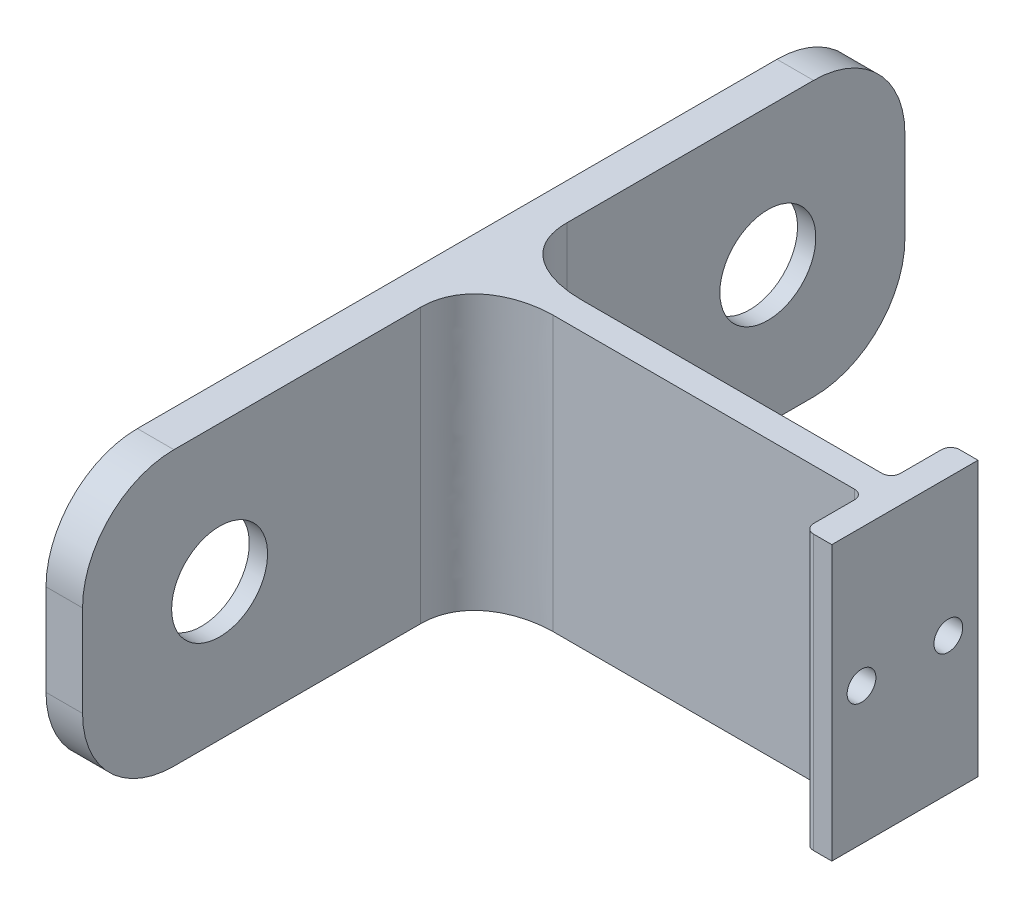
ISO-10303-21;
HEADER;
FILE_DESCRIPTION(('STEP AP214'),'2;1');
FILE_NAME('part.step','',(''),(''),'','','');
FILE_SCHEMA(('AUTOMOTIVE_DESIGN { 1 0 10303 214 1 1 1 1 }'));
ENDSEC;
DATA;
#1=APPLICATION_CONTEXT('core data for automotive mechanical design processes');
#2=APPLICATION_PROTOCOL_DEFINITION('international standard','automotive_design',2000,#1);
#3=PRODUCT_CONTEXT('',#1,'mechanical');
#4=PRODUCT('Part','Part','',(#3));
#5=PRODUCT_RELATED_PRODUCT_CATEGORY('part','',(#4));
#6=PRODUCT_DEFINITION_FORMATION('','',#4);
#7=PRODUCT_DEFINITION_CONTEXT('part definition',#1,'design');
#8=PRODUCT_DEFINITION('design','',#6,#7);
#9=PRODUCT_DEFINITION_SHAPE('','',#8);
#10=(LENGTH_UNIT() NAMED_UNIT(*) SI_UNIT(.MILLI.,.METRE.));
#11=(NAMED_UNIT(*) PLANE_ANGLE_UNIT() SI_UNIT($,.RADIAN.));
#12=(NAMED_UNIT(*) SI_UNIT($,.STERADIAN.) SOLID_ANGLE_UNIT());
#13=UNCERTAINTY_MEASURE_WITH_UNIT(LENGTH_MEASURE(1.E-05),#10,'distance_accuracy_value','');
#14=(GEOMETRIC_REPRESENTATION_CONTEXT(3) GLOBAL_UNCERTAINTY_ASSIGNED_CONTEXT((#13)) GLOBAL_UNIT_ASSIGNED_CONTEXT((#10,
#11,#12)) REPRESENTATION_CONTEXT('',''));
#15=CARTESIAN_POINT('',(0.,0.,0.));
#16=DIRECTION('',(0.,0.,1.));
#17=DIRECTION('',(1.,0.,0.));
#18=AXIS2_PLACEMENT_3D('',#15,#16,#17);
#19=CARTESIAN_POINT('',(4.,15.,45.));
#20=DIRECTION('',(0.,-1.,0.));
#21=DIRECTION('',(0.,0.,-1.));
#22=AXIS2_PLACEMENT_3D('',#19,#20,#21);
#23=PLANE('',#22);
#24=DIRECTION('',(0.,0.,1.));
#25=VECTOR('',#24,1.);
#26=CARTESIAN_POINT('',(46.,15.,-8.));
#27=LINE('',#26,#25);
#28=CARTESIAN_POINT('',(46.,15.,2.5));
#29=VERTEX_POINT('',#28);
#30=CARTESIAN_POINT('',(46.,15.,7.));
#31=VERTEX_POINT('',#30);
#32=EDGE_CURVE('E450',#29,#31,#27,.T.);
#33=ORIENTED_EDGE('',*,*,#32,.T.);
#34=CARTESIAN_POINT('',(47.,15.,7.));
#35=DIRECTION('',(0.,-1.,0.));
#36=DIRECTION('',(0.,0.,-1.));
#37=AXIS2_PLACEMENT_3D('',#34,#35,#36);
#38=CIRCLE('',#37,1.);
#39=CARTESIAN_POINT('',(47.,15.,8.));
#40=VERTEX_POINT('',#39);
#41=EDGE_CURVE('E352',#31,#40,#38,.F.);
#42=ORIENTED_EDGE('',*,*,#41,.T.);
#43=DIRECTION('',(-1.,0.,0.));
#44=VECTOR('',#43,1.);
#45=CARTESIAN_POINT('',(49.,15.,8.));
#46=LINE('',#45,#44);
#47=CARTESIAN_POINT('',(49.,15.,8.));
#48=VERTEX_POINT('',#47);
#49=EDGE_CURVE('E443',#48,#40,#46,.T.);
#50=ORIENTED_EDGE('',*,*,#49,.F.);
#51=DIRECTION('',(0.,0.,1.));
#52=VECTOR('',#51,1.);
#53=CARTESIAN_POINT('',(49.,15.,-8.));
#54=LINE('',#53,#52);
#55=CARTESIAN_POINT('',(49.,15.,-8.));
#56=VERTEX_POINT('',#55);
#57=EDGE_CURVE('E446',#56,#48,#54,.T.);
#58=ORIENTED_EDGE('',*,*,#57,.F.);
#59=DIRECTION('',(-1.,0.,0.));
#60=VECTOR('',#59,1.);
#61=CARTESIAN_POINT('',(49.,15.,-8.));
#62=LINE('',#61,#60);
#63=CARTESIAN_POINT('',(47.,15.,-8.));
#64=VERTEX_POINT('',#63);
#65=EDGE_CURVE('E440',#56,#64,#62,.T.);
#66=ORIENTED_EDGE('',*,*,#65,.T.);
#67=CARTESIAN_POINT('',(47.,15.,-7.));
#68=DIRECTION('',(0.,-1.,0.));
#69=DIRECTION('',(0.,0.,-1.));
#70=AXIS2_PLACEMENT_3D('',#67,#68,#69);
#71=CIRCLE('',#70,1.);
#72=CARTESIAN_POINT('',(46.,15.,-7.));
#73=VERTEX_POINT('',#72);
#74=EDGE_CURVE('E354',#64,#73,#71,.F.);
#75=ORIENTED_EDGE('',*,*,#74,.T.);
#76=CARTESIAN_POINT('',(46.,15.,-2.5));
#77=VERTEX_POINT('',#76);
#78=EDGE_CURVE('E447',#73,#77,#27,.T.);
#79=ORIENTED_EDGE('',*,*,#78,.T.);
#80=CARTESIAN_POINT('',(45.,15.,-2.5));
#81=DIRECTION('',(0.,-1.,0.));
#82=DIRECTION('',(0.,0.,-1.));
#83=AXIS2_PLACEMENT_3D('',#80,#81,#82);
#84=CIRCLE('',#83,1.);
#85=CARTESIAN_POINT('',(45.,15.,-1.5));
#86=VERTEX_POINT('',#85);
#87=EDGE_CURVE('E47',#77,#86,#84,.T.);
#88=ORIENTED_EDGE('',*,*,#87,.T.);
#89=DIRECTION('',(-1.,0.,0.));
#90=VECTOR('',#89,1.);
#91=CARTESIAN_POINT('',(46.,15.,-1.5));
#92=LINE('',#91,#90);
#93=CARTESIAN_POINT('',(12.,15.,-1.5));
#94=VERTEX_POINT('',#93);
#95=EDGE_CURVE('E205',#86,#94,#92,.T.);
#96=ORIENTED_EDGE('',*,*,#95,.T.);
#97=CARTESIAN_POINT('',(12.,15.,-1.5));
#98=CARTESIAN_POINT('',(8.56407864531862,15.,-1.49999999999999));
#99=CARTESIAN_POINT('',(4.00000000000002,15.,-3.00658043213434));
#100=CARTESIAN_POINT('',(4.,15.,-7.99999999999999));
#101=B_SPLINE_CURVE_WITH_KNOTS('',3,(#97,#98,#99,#100),.UNSPECIFIED.,.F.,.F.,(4,4),(0.,1.),.UNSPECIFIED.);
#102=CARTESIAN_POINT('',(4.,15.,-7.99999999999999));
#103=VERTEX_POINT('',#102);
#104=EDGE_CURVE('E210',#103,#94,#101,.F.);
#105=ORIENTED_EDGE('',*,*,#104,.F.);
#106=DIRECTION('',(0.,0.,1.));
#107=VECTOR('',#106,1.);
#108=CARTESIAN_POINT('',(4.,15.,45.));
#109=LINE('',#108,#107);
#110=CARTESIAN_POINT('',(4.,15.,-35.));
#111=VERTEX_POINT('',#110);
#112=EDGE_CURVE('E201',#111,#103,#109,.T.);
#113=ORIENTED_EDGE('',*,*,#112,.F.);
#114=DIRECTION('',(-1.,0.,0.));
#115=VECTOR('',#114,1.);
#116=CARTESIAN_POINT('',(4.,15.,-35.));
#117=LINE('',#116,#115);
#118=CARTESIAN_POINT('',(0.,15.,-35.));
#119=VERTEX_POINT('',#118);
#120=EDGE_CURVE('E372',#111,#119,#117,.T.);
#121=ORIENTED_EDGE('',*,*,#120,.T.);
#122=DIRECTION('',(0.,0.,1.));
#123=VECTOR('',#122,1.);
#124=CARTESIAN_POINT('',(0.,15.,45.));
#125=LINE('',#124,#123);
#126=CARTESIAN_POINT('',(0.,15.,35.));
#127=VERTEX_POINT('',#126);
#128=EDGE_CURVE('E414',#119,#127,#125,.T.);
#129=ORIENTED_EDGE('',*,*,#128,.T.);
#130=DIRECTION('',(-1.,0.,0.));
#131=VECTOR('',#130,1.);
#132=CARTESIAN_POINT('',(4.,15.,35.));
#133=LINE('',#132,#131);
#134=CARTESIAN_POINT('',(4.,15.,35.));
#135=VERTEX_POINT('',#134);
#136=EDGE_CURVE('E375',#127,#135,#133,.F.);
#137=ORIENTED_EDGE('',*,*,#136,.T.);
#138=CARTESIAN_POINT('',(4.,14.9999999999998,8.));
#139=VERTEX_POINT('',#138);
#140=EDGE_CURVE('E424',#139,#135,#109,.T.);
#141=ORIENTED_EDGE('',*,*,#140,.F.);
#142=CARTESIAN_POINT('',(12.,15.,1.5));
#143=CARTESIAN_POINT('',(8.56407864531861,15.,1.49999999999999));
#144=CARTESIAN_POINT('',(4.00000000000002,15.,3.22616485346249));
#145=CARTESIAN_POINT('',(4.,15.,8.));
#146=B_SPLINE_CURVE_WITH_KNOTS('',3,(#142,#143,#144,#145),.UNSPECIFIED.,.F.,.F.,(4,4),(0.,1.),.UNSPECIFIED.);
#147=CARTESIAN_POINT('',(12.,14.9999999999998,1.5));
#148=VERTEX_POINT('',#147);
#149=EDGE_CURVE('E472',#139,#148,#146,.F.);
#150=ORIENTED_EDGE('',*,*,#149,.T.);
#151=DIRECTION('',(-1.,0.,0.));
#152=VECTOR('',#151,1.);
#153=CARTESIAN_POINT('',(46.,15.,1.5));
#154=LINE('',#153,#152);
#155=CARTESIAN_POINT('',(45.,15.,1.5));
#156=VERTEX_POINT('',#155);
#157=EDGE_CURVE('E429',#156,#148,#154,.T.);
#158=ORIENTED_EDGE('',*,*,#157,.F.);
#159=CARTESIAN_POINT('',(45.,15.,2.5));
#160=DIRECTION('',(0.,-1.,0.));
#161=DIRECTION('',(0.,0.,-1.));
#162=AXIS2_PLACEMENT_3D('',#159,#160,#161);
#163=CIRCLE('',#162,1.);
#164=EDGE_CURVE('E11',#156,#29,#163,.T.);
#165=ORIENTED_EDGE('',*,*,#164,.T.);
#166=EDGE_LOOP('',(#33,#42,#50,#58,#66,#75,#79,#88,#96,#105,#113,#121,#129,#137,#141,#150,#158,#165));
#167=FACE_BOUND('',#166,.T.);
#168=ADVANCED_FACE('F32',(#167),#23,.F.);
#169=CARTESIAN_POINT('',(4.,-15.,45.));
#170=DIRECTION('',(0.,1.,0.));
#171=DIRECTION('',(0.,0.,1.));
#172=AXIS2_PLACEMENT_3D('',#169,#170,#171);
#173=PLANE('',#172);
#174=DIRECTION('',(-1.,0.,0.));
#175=VECTOR('',#174,1.);
#176=CARTESIAN_POINT('',(49.,-15.,8.));
#177=LINE('',#176,#175);
#178=CARTESIAN_POINT('',(49.,-15.,8.));
#179=VERTEX_POINT('',#178);
#180=CARTESIAN_POINT('',(47.,-15.,8.));
#181=VERTEX_POINT('',#180);
#182=EDGE_CURVE('E435',#179,#181,#177,.T.);
#183=ORIENTED_EDGE('',*,*,#182,.T.);
#184=CARTESIAN_POINT('',(47.,-15.,7.));
#185=DIRECTION('',(0.,1.,0.));
#186=DIRECTION('',(0.,0.,1.));
#187=AXIS2_PLACEMENT_3D('',#184,#185,#186);
#188=CIRCLE('',#187,1.);
#189=CARTESIAN_POINT('',(46.,-15.,7.));
#190=VERTEX_POINT('',#189);
#191=EDGE_CURVE('E361',#181,#190,#188,.F.);
#192=ORIENTED_EDGE('',*,*,#191,.T.);
#193=DIRECTION('',(0.,0.,-1.));
#194=VECTOR('',#193,1.);
#195=CARTESIAN_POINT('',(46.,-15.,-8.));
#196=LINE('',#195,#194);
#197=CARTESIAN_POINT('',(46.,-15.,2.5));
#198=VERTEX_POINT('',#197);
#199=EDGE_CURVE('E451',#190,#198,#196,.T.);
#200=ORIENTED_EDGE('',*,*,#199,.T.);
#201=CARTESIAN_POINT('',(45.,-15.,2.5));
#202=DIRECTION('',(0.,1.,0.));
#203=DIRECTION('',(0.,0.,1.));
#204=AXIS2_PLACEMENT_3D('',#201,#202,#203);
#205=CIRCLE('',#204,1.);
#206=CARTESIAN_POINT('',(45.,-15.,1.5));
#207=VERTEX_POINT('',#206);
#208=EDGE_CURVE('E40',#198,#207,#205,.T.);
#209=ORIENTED_EDGE('',*,*,#208,.T.);
#210=DIRECTION('',(-1.,0.,0.));
#211=VECTOR('',#210,1.);
#212=CARTESIAN_POINT('',(46.,-15.,1.5));
#213=LINE('',#212,#211);
#214=CARTESIAN_POINT('',(12.,-15.0000000000002,1.5));
#215=VERTEX_POINT('',#214);
#216=EDGE_CURVE('E431',#207,#215,#213,.T.);
#217=ORIENTED_EDGE('',*,*,#216,.T.);
#218=CARTESIAN_POINT('',(12.,-15.,1.5));
#219=CARTESIAN_POINT('',(8.56407864531861,-15.,1.49999999999999));
#220=CARTESIAN_POINT('',(4.00000000000002,-15.,3.22616485346249));
#221=CARTESIAN_POINT('',(4.,-15.,8.));
#222=B_SPLINE_CURVE_WITH_KNOTS('',3,(#218,#219,#220,#221),.UNSPECIFIED.,.F.,.F.,(4,4),(0.,1.),.UNSPECIFIED.);
#223=CARTESIAN_POINT('',(4.,-15.,8.));
#224=VERTEX_POINT('',#223);
#225=EDGE_CURVE('E213',#215,#224,#222,.T.);
#226=ORIENTED_EDGE('',*,*,#225,.T.);
#227=DIRECTION('',(0.,0.,-1.));
#228=VECTOR('',#227,1.);
#229=CARTESIAN_POINT('',(4.,-15.,45.));
#230=LINE('',#229,#228);
#231=CARTESIAN_POINT('',(4.,-15.,35.));
#232=VERTEX_POINT('',#231);
#233=EDGE_CURVE('E193',#232,#224,#230,.T.);
#234=ORIENTED_EDGE('',*,*,#233,.F.);
#235=DIRECTION('',(-1.,0.,0.));
#236=VECTOR('',#235,1.);
#237=CARTESIAN_POINT('',(4.,-15.,35.));
#238=LINE('',#237,#236);
#239=CARTESIAN_POINT('',(0.,-15.,35.));
#240=VERTEX_POINT('',#239);
#241=EDGE_CURVE('E404',#232,#240,#238,.T.);
#242=ORIENTED_EDGE('',*,*,#241,.T.);
#243=DIRECTION('',(0.,0.,-1.));
#244=VECTOR('',#243,1.);
#245=CARTESIAN_POINT('',(0.,-15.,45.));
#246=LINE('',#245,#244);
#247=CARTESIAN_POINT('',(0.,-15.,-35.));
#248=VERTEX_POINT('',#247);
#249=EDGE_CURVE('E408',#240,#248,#246,.T.);
#250=ORIENTED_EDGE('',*,*,#249,.T.);
#251=DIRECTION('',(-1.,0.,0.));
#252=VECTOR('',#251,1.);
#253=CARTESIAN_POINT('',(4.,-15.,-35.));
#254=LINE('',#253,#252);
#255=CARTESIAN_POINT('',(4.,-15.,-35.));
#256=VERTEX_POINT('',#255);
#257=EDGE_CURVE('E190',#248,#256,#254,.F.);
#258=ORIENTED_EDGE('',*,*,#257,.T.);
#259=CARTESIAN_POINT('',(4.,-15.,-7.99999999999999));
#260=VERTEX_POINT('',#259);
#261=EDGE_CURVE('E180',#260,#256,#230,.T.);
#262=ORIENTED_EDGE('',*,*,#261,.F.);
#263=CARTESIAN_POINT('',(12.,-15.,-1.5));
#264=CARTESIAN_POINT('',(8.56407864531862,-15.,-1.49999999999999));
#265=CARTESIAN_POINT('',(4.00000000000002,-15.,-3.00658043213434));
#266=CARTESIAN_POINT('',(4.,-15.,-7.99999999999999));
#267=B_SPLINE_CURVE_WITH_KNOTS('',3,(#263,#264,#265,#266),.UNSPECIFIED.,.F.,.F.,(4,4),(0.,1.),.UNSPECIFIED.);
#268=CARTESIAN_POINT('',(12.,-15.,-1.5));
#269=VERTEX_POINT('',#268);
#270=EDGE_CURVE('E186',#269,#260,#267,.T.);
#271=ORIENTED_EDGE('',*,*,#270,.F.);
#272=DIRECTION('',(-1.,0.,0.));
#273=VECTOR('',#272,1.);
#274=CARTESIAN_POINT('',(46.,-15.,-1.5));
#275=LINE('',#274,#273);
#276=CARTESIAN_POINT('',(45.,-15.,-1.5));
#277=VERTEX_POINT('',#276);
#278=EDGE_CURVE('E433',#277,#269,#275,.T.);
#279=ORIENTED_EDGE('',*,*,#278,.F.);
#280=CARTESIAN_POINT('',(45.,-15.,-2.5));
#281=DIRECTION('',(0.,1.,0.));
#282=DIRECTION('',(0.,0.,1.));
#283=AXIS2_PLACEMENT_3D('',#280,#281,#282);
#284=CIRCLE('',#283,1.);
#285=CARTESIAN_POINT('',(46.,-15.,-2.5));
#286=VERTEX_POINT('',#285);
#287=EDGE_CURVE('E335',#277,#286,#284,.T.);
#288=ORIENTED_EDGE('',*,*,#287,.T.);
#289=CARTESIAN_POINT('',(46.,-15.,-7.));
#290=VERTEX_POINT('',#289);
#291=EDGE_CURVE('E454',#286,#290,#196,.T.);
#292=ORIENTED_EDGE('',*,*,#291,.T.);
#293=CARTESIAN_POINT('',(47.,-15.,-7.));
#294=DIRECTION('',(0.,1.,0.));
#295=DIRECTION('',(0.,0.,1.));
#296=AXIS2_PLACEMENT_3D('',#293,#294,#295);
#297=CIRCLE('',#296,1.);
#298=CARTESIAN_POINT('',(47.,-15.,-8.));
#299=VERTEX_POINT('',#298);
#300=EDGE_CURVE('E363',#290,#299,#297,.F.);
#301=ORIENTED_EDGE('',*,*,#300,.T.);
#302=DIRECTION('',(-1.,0.,0.));
#303=VECTOR('',#302,1.);
#304=CARTESIAN_POINT('',(49.,-15.,-8.));
#305=LINE('',#304,#303);
#306=CARTESIAN_POINT('',(49.,-15.,-8.));
#307=VERTEX_POINT('',#306);
#308=EDGE_CURVE('E437',#307,#299,#305,.T.);
#309=ORIENTED_EDGE('',*,*,#308,.F.);
#310=DIRECTION('',(0.,0.,-1.));
#311=VECTOR('',#310,1.);
#312=CARTESIAN_POINT('',(49.,-15.,-8.));
#313=LINE('',#312,#311);
#314=EDGE_CURVE('E458',#179,#307,#313,.T.);
#315=ORIENTED_EDGE('',*,*,#314,.F.);
#316=EDGE_LOOP('',(#183,#192,#200,#209,#217,#226,#234,#242,#250,#258,#262,#271,#279,#288,#292,
#301,#309,#315));
#317=FACE_BOUND('',#316,.T.);
#318=ADVANCED_FACE('F183',(#317),#173,.F.);
#319=CARTESIAN_POINT('',(4.,0.,0.));
#320=DIRECTION('',(-1.,0.,0.));
#321=DIRECTION('',(0.,0.,1.));
#322=AXIS2_PLACEMENT_3D('',#319,#320,#321);
#323=PLANE('',#322);
#324=CARTESIAN_POINT('',(4.,0.,-30.));
#325=DIRECTION('',(-1.,0.,0.));
#326=DIRECTION('',(0.,0.,1.));
#327=AXIS2_PLACEMENT_3D('',#324,#325,#326);
#328=CIRCLE('',#327,5.25);
#329=CARTESIAN_POINT('',(4.,0.,-24.75));
#330=VERTEX_POINT('',#329);
#331=EDGE_CURVE('E679',#330,#330,#328,.T.);
#332=ORIENTED_EDGE('',*,*,#331,.T.);
#333=EDGE_LOOP('',(#332));
#334=FACE_BOUND('',#333,.T.);
#335=DIRECTION('',(0.,1.,0.));
#336=VECTOR('',#335,1.);
#337=CARTESIAN_POINT('',(4.,-15.,-8.));
#338=LINE('',#337,#336);
#339=EDGE_CURVE('E198',#260,#103,#338,.T.);
#340=ORIENTED_EDGE('',*,*,#339,.F.);
#341=ORIENTED_EDGE('',*,*,#261,.T.);
#342=CARTESIAN_POINT('',(4.,-5.,-35.));
#343=DIRECTION('',(-1.,0.,0.));
#344=DIRECTION('',(0.,0.,1.));
#345=AXIS2_PLACEMENT_3D('',#342,#343,#344);
#346=CIRCLE('',#345,10.);
#347=CARTESIAN_POINT('',(4.,-5.,-45.));
#348=VERTEX_POINT('',#347);
#349=EDGE_CURVE('E385',#256,#348,#346,.F.);
#350=ORIENTED_EDGE('',*,*,#349,.T.);
#351=DIRECTION('',(0.,1.,0.));
#352=VECTOR('',#351,1.);
#353=CARTESIAN_POINT('',(4.,-15.,-45.));
#354=LINE('',#353,#352);
#355=CARTESIAN_POINT('',(4.,5.00000000000001,-45.));
#356=VERTEX_POINT('',#355);
#357=EDGE_CURVE('E410',#348,#356,#354,.T.);
#358=ORIENTED_EDGE('',*,*,#357,.T.);
#359=CARTESIAN_POINT('',(4.,5.,-35.));
#360=DIRECTION('',(-1.,0.,0.));
#361=DIRECTION('',(0.,0.,1.));
#362=AXIS2_PLACEMENT_3D('',#359,#360,#361);
#363=CIRCLE('',#362,10.);
#364=EDGE_CURVE('E387',#356,#111,#363,.F.);
#365=ORIENTED_EDGE('',*,*,#364,.T.);
#366=ORIENTED_EDGE('',*,*,#112,.T.);
#367=EDGE_LOOP('',(#340,#341,#350,#358,#365,#366));
#368=FACE_BOUND('',#367,.T.);
#369=ADVANCED_FACE('F199',(#334,#368),#323,.F.);
#370=CARTESIAN_POINT('',(4.,0.,30.));
#371=DIRECTION('',(-1.,0.,0.));
#372=DIRECTION('',(0.,0.,1.));
#373=AXIS2_PLACEMENT_3D('',#370,#371,#372);
#374=CIRCLE('',#373,5.25);
#375=CARTESIAN_POINT('',(4.,0.,35.25));
#376=VERTEX_POINT('',#375);
#377=EDGE_CURVE('E687',#376,#376,#374,.T.);
#378=ORIENTED_EDGE('',*,*,#377,.T.);
#379=EDGE_LOOP('',(#378));
#380=FACE_BOUND('',#379,.T.);
#381=DIRECTION('',(0.,-1.,0.));
#382=VECTOR('',#381,1.);
#383=CARTESIAN_POINT('',(4.,-15.,8.));
#384=LINE('',#383,#382);
#385=EDGE_CURVE('E204',#139,#224,#384,.T.);
#386=ORIENTED_EDGE('',*,*,#385,.F.);
#387=ORIENTED_EDGE('',*,*,#140,.T.);
#388=CARTESIAN_POINT('',(4.,5.00000000000001,35.));
#389=DIRECTION('',(-1.,0.,0.));
#390=DIRECTION('',(0.,0.,1.));
#391=AXIS2_PLACEMENT_3D('',#388,#389,#390);
#392=CIRCLE('',#391,10.);
#393=CARTESIAN_POINT('',(4.,5.00000000000001,45.));
#394=VERTEX_POINT('',#393);
#395=EDGE_CURVE('E389',#135,#394,#392,.F.);
#396=ORIENTED_EDGE('',*,*,#395,.T.);
#397=DIRECTION('',(0.,-1.,0.));
#398=VECTOR('',#397,1.);
#399=CARTESIAN_POINT('',(4.,-15.,45.));
#400=LINE('',#399,#398);
#401=CARTESIAN_POINT('',(4.,-5.,45.));
#402=VERTEX_POINT('',#401);
#403=EDGE_CURVE('E194',#394,#402,#400,.T.);
#404=ORIENTED_EDGE('',*,*,#403,.T.);
#405=CARTESIAN_POINT('',(4.,-5.,35.));
#406=DIRECTION('',(-1.,0.,0.));
#407=DIRECTION('',(0.,0.,1.));
#408=AXIS2_PLACEMENT_3D('',#405,#406,#407);
#409=CIRCLE('',#408,10.);
#410=EDGE_CURVE('E383',#402,#232,#409,.F.);
#411=ORIENTED_EDGE('',*,*,#410,.T.);
#412=ORIENTED_EDGE('',*,*,#233,.T.);
#413=EDGE_LOOP('',(#386,#387,#396,#404,#411,#412));
#414=FACE_BOUND('',#413,.T.);
#415=ADVANCED_FACE('F287',(#380,#414),#323,.F.);
#416=CARTESIAN_POINT('',(4.,-15.,-45.));
#417=DIRECTION('',(0.,0.,1.));
#418=DIRECTION('',(1.,0.,0.));
#419=AXIS2_PLACEMENT_3D('',#416,#417,#418);
#420=PLANE('',#419);
#421=ORIENTED_EDGE('',*,*,#357,.F.);
#422=DIRECTION('',(-1.,0.,0.));
#423=VECTOR('',#422,1.);
#424=CARTESIAN_POINT('',(4.,-5.,-45.));
#425=LINE('',#424,#423);
#426=CARTESIAN_POINT('',(0.,-5.,-45.));
#427=VERTEX_POINT('',#426);
#428=EDGE_CURVE('E378',#348,#427,#425,.T.);
#429=ORIENTED_EDGE('',*,*,#428,.T.);
#430=DIRECTION('',(0.,1.,0.));
#431=VECTOR('',#430,1.);
#432=CARTESIAN_POINT('',(0.,-15.,-45.));
#433=LINE('',#432,#431);
#434=CARTESIAN_POINT('',(0.,5.00000000000001,-45.));
#435=VERTEX_POINT('',#434);
#436=EDGE_CURVE('E417',#427,#435,#433,.T.);
#437=ORIENTED_EDGE('',*,*,#436,.T.);
#438=DIRECTION('',(-1.,0.,0.));
#439=VECTOR('',#438,1.);
#440=CARTESIAN_POINT('',(4.,5.00000000000001,-45.));
#441=LINE('',#440,#439);
#442=EDGE_CURVE('E381',#435,#356,#441,.F.);
#443=ORIENTED_EDGE('',*,*,#442,.T.);
#444=EDGE_LOOP('',(#421,#429,#437,#443));
#445=FACE_BOUND('',#444,.T.);
#446=ADVANCED_FACE('F299',(#445),#420,.F.);
#447=CARTESIAN_POINT('',(4.,-15.,45.));
#448=DIRECTION('',(0.,0.,-1.));
#449=DIRECTION('',(-1.,0.,0.));
#450=AXIS2_PLACEMENT_3D('',#447,#448,#449);
#451=PLANE('',#450);
#452=DIRECTION('',(0.,-1.,0.));
#453=VECTOR('',#452,1.);
#454=CARTESIAN_POINT('',(0.,-15.,45.));
#455=LINE('',#454,#453);
#456=CARTESIAN_POINT('',(0.,5.00000000000001,45.));
#457=VERTEX_POINT('',#456);
#458=CARTESIAN_POINT('',(0.,-5.,45.));
#459=VERTEX_POINT('',#458);
#460=EDGE_CURVE('E411',#457,#459,#455,.T.);
#461=ORIENTED_EDGE('',*,*,#460,.T.);
#462=DIRECTION('',(-1.,0.,0.));
#463=VECTOR('',#462,1.);
#464=CARTESIAN_POINT('',(4.,-5.,45.));
#465=LINE('',#464,#463);
#466=EDGE_CURVE('E391',#459,#402,#465,.F.);
#467=ORIENTED_EDGE('',*,*,#466,.T.);
#468=ORIENTED_EDGE('',*,*,#403,.F.);
#469=DIRECTION('',(-1.,0.,0.));
#470=VECTOR('',#469,1.);
#471=CARTESIAN_POINT('',(4.,5.00000000000001,45.));
#472=LINE('',#471,#470);
#473=EDGE_CURVE('E393',#394,#457,#472,.T.);
#474=ORIENTED_EDGE('',*,*,#473,.T.);
#475=EDGE_LOOP('',(#461,#467,#468,#474));
#476=FACE_BOUND('',#475,.T.);
#477=ADVANCED_FACE('F293',(#476),#451,.F.);
#478=CARTESIAN_POINT('',(0.,0.,0.));
#479=DIRECTION('',(-1.,0.,0.));
#480=DIRECTION('',(0.,0.,1.));
#481=AXIS2_PLACEMENT_3D('',#478,#479,#480);
#482=PLANE('',#481);
#483=CARTESIAN_POINT('',(0.,0.,-30.));
#484=DIRECTION('',(-1.,0.,0.));
#485=DIRECTION('',(0.,0.,1.));
#486=AXIS2_PLACEMENT_3D('',#483,#484,#485);
#487=CIRCLE('',#486,11.);
#488=CARTESIAN_POINT('',(0.,0.,-19.));
#489=VERTEX_POINT('',#488);
#490=EDGE_CURVE('E690',#489,#489,#487,.T.);
#491=ORIENTED_EDGE('',*,*,#490,.F.);
#492=EDGE_LOOP('',(#491));
#493=FACE_BOUND('',#492,.T.);
#494=CARTESIAN_POINT('',(0.,0.,30.));
#495=DIRECTION('',(-1.,0.,0.));
#496=DIRECTION('',(0.,0.,1.));
#497=AXIS2_PLACEMENT_3D('',#494,#495,#496);
#498=CIRCLE('',#497,11.);
#499=CARTESIAN_POINT('',(0.,0.,41.));
#500=VERTEX_POINT('',#499);
#501=EDGE_CURVE('E216',#500,#500,#498,.T.);
#502=ORIENTED_EDGE('',*,*,#501,.F.);
#503=EDGE_LOOP('',(#502));
#504=FACE_BOUND('',#503,.T.);
#505=ORIENTED_EDGE('',*,*,#249,.F.);
#506=CARTESIAN_POINT('',(0.,-5.,35.));
#507=DIRECTION('',(-1.,0.,0.));
#508=DIRECTION('',(0.,0.,1.));
#509=AXIS2_PLACEMENT_3D('',#506,#507,#508);
#510=CIRCLE('',#509,10.);
#511=EDGE_CURVE('E396',#240,#459,#510,.T.);
#512=ORIENTED_EDGE('',*,*,#511,.T.);
#513=ORIENTED_EDGE('',*,*,#460,.F.);
#514=CARTESIAN_POINT('',(0.,5.00000000000001,35.));
#515=DIRECTION('',(-1.,0.,0.));
#516=DIRECTION('',(0.,0.,1.));
#517=AXIS2_PLACEMENT_3D('',#514,#515,#516);
#518=CIRCLE('',#517,10.);
#519=EDGE_CURVE('E402',#457,#127,#518,.T.);
#520=ORIENTED_EDGE('',*,*,#519,.T.);
#521=ORIENTED_EDGE('',*,*,#128,.F.);
#522=CARTESIAN_POINT('',(0.,5.,-35.));
#523=DIRECTION('',(-1.,0.,0.));
#524=DIRECTION('',(0.,0.,1.));
#525=AXIS2_PLACEMENT_3D('',#522,#523,#524);
#526=CIRCLE('',#525,10.);
#527=EDGE_CURVE('E400',#119,#435,#526,.T.);
#528=ORIENTED_EDGE('',*,*,#527,.T.);
#529=ORIENTED_EDGE('',*,*,#436,.F.);
#530=CARTESIAN_POINT('',(0.,-5.,-35.));
#531=DIRECTION('',(-1.,0.,0.));
#532=DIRECTION('',(0.,0.,1.));
#533=AXIS2_PLACEMENT_3D('',#530,#531,#532);
#534=CIRCLE('',#533,10.);
#535=EDGE_CURVE('E398',#427,#248,#534,.T.);
#536=ORIENTED_EDGE('',*,*,#535,.T.);
#537=EDGE_LOOP('',(#505,#512,#513,#520,#521,#528,#529,#536));
#538=FACE_BOUND('',#537,.T.);
#539=ADVANCED_FACE('F289',(#493,#504,#538),#482,.T.);
#540=CARTESIAN_POINT('',(4.,-5.,35.));
#541=DIRECTION('',(-1.,0.,0.));
#542=DIRECTION('',(0.,0.,1.));
#543=AXIS2_PLACEMENT_3D('',#540,#541,#542);
#544=CYLINDRICAL_SURFACE('',#543,10.);
#545=ORIENTED_EDGE('',*,*,#410,.F.);
#546=ORIENTED_EDGE('',*,*,#466,.F.);
#547=ORIENTED_EDGE('',*,*,#511,.F.);
#548=ORIENTED_EDGE('',*,*,#241,.F.);
#549=EDGE_LOOP('',(#545,#546,#547,#548));
#550=FACE_BOUND('',#549,.T.);
#551=ADVANCED_FACE('F292',(#550),#544,.T.);
#552=CARTESIAN_POINT('',(4.,-5.,-35.));
#553=DIRECTION('',(-1.,0.,0.));
#554=DIRECTION('',(0.,0.,1.));
#555=AXIS2_PLACEMENT_3D('',#552,#553,#554);
#556=CYLINDRICAL_SURFACE('',#555,10.);
#557=ORIENTED_EDGE('',*,*,#349,.F.);
#558=ORIENTED_EDGE('',*,*,#257,.F.);
#559=ORIENTED_EDGE('',*,*,#535,.F.);
#560=ORIENTED_EDGE('',*,*,#428,.F.);
#561=EDGE_LOOP('',(#557,#558,#559,#560));
#562=FACE_BOUND('',#561,.T.);
#563=ADVANCED_FACE('F308',(#562),#556,.T.);
#564=CARTESIAN_POINT('',(4.,5.,-35.));
#565=DIRECTION('',(-1.,0.,0.));
#566=DIRECTION('',(0.,0.,1.));
#567=AXIS2_PLACEMENT_3D('',#564,#565,#566);
#568=CYLINDRICAL_SURFACE('',#567,10.);
#569=ORIENTED_EDGE('',*,*,#364,.F.);
#570=ORIENTED_EDGE('',*,*,#442,.F.);
#571=ORIENTED_EDGE('',*,*,#527,.F.);
#572=ORIENTED_EDGE('',*,*,#120,.F.);
#573=EDGE_LOOP('',(#569,#570,#571,#572));
#574=FACE_BOUND('',#573,.T.);
#575=ADVANCED_FACE('F312',(#574),#568,.T.);
#576=CARTESIAN_POINT('',(4.,5.00000000000001,35.));
#577=DIRECTION('',(-1.,0.,0.));
#578=DIRECTION('',(0.,0.,1.));
#579=AXIS2_PLACEMENT_3D('',#576,#577,#578);
#580=CYLINDRICAL_SURFACE('',#579,10.);
#581=ORIENTED_EDGE('',*,*,#395,.F.);
#582=ORIENTED_EDGE('',*,*,#136,.F.);
#583=ORIENTED_EDGE('',*,*,#519,.F.);
#584=ORIENTED_EDGE('',*,*,#473,.F.);
#585=EDGE_LOOP('',(#581,#582,#583,#584));
#586=FACE_BOUND('',#585,.T.);
#587=ADVANCED_FACE('F283',(#586),#580,.T.);
#588=CARTESIAN_POINT('',(46.,-15.,-1.5));
#589=DIRECTION('',(0.,0.,1.));
#590=DIRECTION('',(1.,0.,0.));
#591=AXIS2_PLACEMENT_3D('',#588,#589,#590);
#592=PLANE('',#591);
#593=ORIENTED_EDGE('',*,*,#95,.F.);
#594=DIRECTION('',(0.,1.,0.));
#595=VECTOR('',#594,1.);
#596=CARTESIAN_POINT('',(45.,-15.,-1.5));
#597=LINE('',#596,#595);
#598=EDGE_CURVE('E336',#86,#277,#597,.F.);
#599=ORIENTED_EDGE('',*,*,#598,.T.);
#600=ORIENTED_EDGE('',*,*,#278,.T.);
#601=DIRECTION('',(0.,1.,0.));
#602=VECTOR('',#601,1.);
#603=CARTESIAN_POINT('',(12.,15.,-1.5));
#604=LINE('',#603,#602);
#605=EDGE_CURVE('E209',#269,#94,#604,.T.);
#606=ORIENTED_EDGE('',*,*,#605,.T.);
#607=EDGE_LOOP('',(#593,#599,#600,#606));
#608=FACE_BOUND('',#607,.T.);
#609=ADVANCED_FACE('F279',(#608),#592,.F.);
#610=CARTESIAN_POINT('',(46.,-15.,1.5));
#611=DIRECTION('',(0.,0.,-1.));
#612=DIRECTION('',(-1.,0.,0.));
#613=AXIS2_PLACEMENT_3D('',#610,#611,#612);
#614=PLANE('',#613);
#615=ORIENTED_EDGE('',*,*,#216,.F.);
#616=DIRECTION('',(0.,-1.,0.));
#617=VECTOR('',#616,1.);
#618=CARTESIAN_POINT('',(45.,15.,1.5));
#619=LINE('',#618,#617);
#620=EDGE_CURVE('E341',#207,#156,#619,.F.);
#621=ORIENTED_EDGE('',*,*,#620,.T.);
#622=ORIENTED_EDGE('',*,*,#157,.T.);
#623=DIRECTION('',(0.,-1.,0.));
#624=VECTOR('',#623,1.);
#625=CARTESIAN_POINT('',(12.,-15.,1.5));
#626=LINE('',#625,#624);
#627=EDGE_CURVE('E368',#148,#215,#626,.T.);
#628=ORIENTED_EDGE('',*,*,#627,.T.);
#629=EDGE_LOOP('',(#615,#621,#622,#628));
#630=FACE_BOUND('',#629,.T.);
#631=ADVANCED_FACE('F268',(#630),#614,.F.);
#632=CARTESIAN_POINT('',(46.,0.,0.));
#633=DIRECTION('',(1.,0.,0.));
#634=DIRECTION('',(0.,0.,-1.));
#635=AXIS2_PLACEMENT_3D('',#632,#633,#634);
#636=PLANE('',#635);
#637=CARTESIAN_POINT('',(46.,0.,-4.75));
#638=DIRECTION('',(1.,0.,0.));
#639=DIRECTION('',(0.,0.,-1.));
#640=AXIS2_PLACEMENT_3D('',#637,#638,#639);
#641=CIRCLE('',#640,1.575);
#642=CARTESIAN_POINT('',(46.,0.,-6.325));
#643=VERTEX_POINT('',#642);
#644=EDGE_CURVE('E465',#643,#643,#641,.T.);
#645=ORIENTED_EDGE('',*,*,#644,.T.);
#646=EDGE_LOOP('',(#645));
#647=FACE_BOUND('',#646,.T.);
#648=ORIENTED_EDGE('',*,*,#78,.F.);
#649=DIRECTION('',(0.,1.,0.));
#650=VECTOR('',#649,1.);
#651=CARTESIAN_POINT('',(46.,0.,-7.));
#652=LINE('',#651,#650);
#653=EDGE_CURVE('E346',#73,#290,#652,.F.);
#654=ORIENTED_EDGE('',*,*,#653,.T.);
#655=ORIENTED_EDGE('',*,*,#291,.F.);
#656=DIRECTION('',(0.,1.,0.));
#657=VECTOR('',#656,1.);
#658=CARTESIAN_POINT('',(46.,15.,-2.5));
#659=LINE('',#658,#657);
#660=EDGE_CURVE('E337',#286,#77,#659,.T.);
#661=ORIENTED_EDGE('',*,*,#660,.T.);
#662=EDGE_LOOP('',(#648,#654,#655,#661));
#663=FACE_BOUND('',#662,.T.);
#664=ADVANCED_FACE('F264',(#647,#663),#636,.F.);
#665=CARTESIAN_POINT('',(46.,0.,4.75));
#666=DIRECTION('',(1.,0.,0.));
#667=DIRECTION('',(0.,0.,-1.));
#668=AXIS2_PLACEMENT_3D('',#665,#666,#667);
#669=CIRCLE('',#668,1.575);
#670=CARTESIAN_POINT('',(46.,0.,3.175));
#671=VERTEX_POINT('',#670);
#672=EDGE_CURVE('E466',#671,#671,#669,.T.);
#673=ORIENTED_EDGE('',*,*,#672,.T.);
#674=EDGE_LOOP('',(#673));
#675=FACE_BOUND('',#674,.T.);
#676=ORIENTED_EDGE('',*,*,#199,.F.);
#677=DIRECTION('',(0.,-1.,0.));
#678=VECTOR('',#677,1.);
#679=CARTESIAN_POINT('',(46.,0.,7.));
#680=LINE('',#679,#678);
#681=EDGE_CURVE('E356',#190,#31,#680,.F.);
#682=ORIENTED_EDGE('',*,*,#681,.T.);
#683=ORIENTED_EDGE('',*,*,#32,.F.);
#684=DIRECTION('',(0.,-1.,0.));
#685=VECTOR('',#684,1.);
#686=CARTESIAN_POINT('',(46.,-15.,2.5));
#687=LINE('',#686,#685);
#688=EDGE_CURVE('E358',#29,#198,#687,.T.);
#689=ORIENTED_EDGE('',*,*,#688,.T.);
#690=EDGE_LOOP('',(#676,#682,#683,#689));
#691=FACE_BOUND('',#690,.T.);
#692=ADVANCED_FACE('F267',(#675,#691),#636,.F.);
#693=CARTESIAN_POINT('',(49.,-15.,8.));
#694=DIRECTION('',(0.,0.,-1.));
#695=DIRECTION('',(-1.,0.,0.));
#696=AXIS2_PLACEMENT_3D('',#693,#694,#695);
#697=PLANE('',#696);
#698=ORIENTED_EDGE('',*,*,#49,.T.);
#699=DIRECTION('',(0.,-1.,0.));
#700=VECTOR('',#699,1.);
#701=CARTESIAN_POINT('',(47.,-15.,8.));
#702=LINE('',#701,#700);
#703=EDGE_CURVE('E365',#40,#181,#702,.T.);
#704=ORIENTED_EDGE('',*,*,#703,.T.);
#705=ORIENTED_EDGE('',*,*,#182,.F.);
#706=DIRECTION('',(0.,-1.,0.));
#707=VECTOR('',#706,1.);
#708=CARTESIAN_POINT('',(49.,-15.,8.));
#709=LINE('',#708,#707);
#710=EDGE_CURVE('E449',#48,#179,#709,.T.);
#711=ORIENTED_EDGE('',*,*,#710,.F.);
#712=EDGE_LOOP('',(#698,#704,#705,#711));
#713=FACE_BOUND('',#712,.T.);
#714=ADVANCED_FACE('F272',(#713),#697,.F.);
#715=CARTESIAN_POINT('',(49.,-15.,-8.));
#716=DIRECTION('',(0.,0.,1.));
#717=DIRECTION('',(1.,0.,0.));
#718=AXIS2_PLACEMENT_3D('',#715,#716,#717);
#719=PLANE('',#718);
#720=ORIENTED_EDGE('',*,*,#308,.T.);
#721=DIRECTION('',(0.,1.,0.));
#722=VECTOR('',#721,1.);
#723=CARTESIAN_POINT('',(47.,-15.,-8.));
#724=LINE('',#723,#722);
#725=EDGE_CURVE('E349',#299,#64,#724,.T.);
#726=ORIENTED_EDGE('',*,*,#725,.T.);
#727=ORIENTED_EDGE('',*,*,#65,.F.);
#728=DIRECTION('',(0.,1.,0.));
#729=VECTOR('',#728,1.);
#730=CARTESIAN_POINT('',(49.,-15.,-8.));
#731=LINE('',#730,#729);
#732=EDGE_CURVE('E456',#307,#56,#731,.T.);
#733=ORIENTED_EDGE('',*,*,#732,.F.);
#734=EDGE_LOOP('',(#720,#726,#727,#733));
#735=FACE_BOUND('',#734,.T.);
#736=ADVANCED_FACE('F262',(#735),#719,.F.);
#737=CARTESIAN_POINT('',(49.,0.,0.));
#738=DIRECTION('',(1.,0.,0.));
#739=DIRECTION('',(0.,0.,-1.));
#740=AXIS2_PLACEMENT_3D('',#737,#738,#739);
#741=PLANE('',#740);
#742=CARTESIAN_POINT('',(49.,0.,4.75));
#743=DIRECTION('',(1.,0.,0.));
#744=DIRECTION('',(0.,0.,-1.));
#745=AXIS2_PLACEMENT_3D('',#742,#743,#744);
#746=CIRCLE('',#745,1.575);
#747=CARTESIAN_POINT('',(49.,0.,3.175));
#748=VERTEX_POINT('',#747);
#749=EDGE_CURVE('E469',#748,#748,#746,.T.);
#750=ORIENTED_EDGE('',*,*,#749,.F.);
#751=EDGE_LOOP('',(#750));
#752=FACE_BOUND('',#751,.T.);
#753=CARTESIAN_POINT('',(49.,0.,-4.75));
#754=DIRECTION('',(1.,0.,0.));
#755=DIRECTION('',(0.,0.,-1.));
#756=AXIS2_PLACEMENT_3D('',#753,#754,#755);
#757=CIRCLE('',#756,1.575);
#758=CARTESIAN_POINT('',(49.,0.,-6.325));
#759=VERTEX_POINT('',#758);
#760=EDGE_CURVE('E462',#759,#759,#757,.T.);
#761=ORIENTED_EDGE('',*,*,#760,.F.);
#762=EDGE_LOOP('',(#761));
#763=FACE_BOUND('',#762,.T.);
#764=ORIENTED_EDGE('',*,*,#710,.T.);
#765=ORIENTED_EDGE('',*,*,#314,.T.);
#766=ORIENTED_EDGE('',*,*,#732,.T.);
#767=ORIENTED_EDGE('',*,*,#57,.T.);
#768=EDGE_LOOP('',(#764,#765,#766,#767));
#769=FACE_BOUND('',#768,.T.);
#770=ADVANCED_FACE('F258',(#752,#763,#769),#741,.T.);
#771=CARTESIAN_POINT('',(46.,0.,-4.75));
#772=DIRECTION('',(1.,0.,0.));
#773=DIRECTION('',(0.,0.,-1.));
#774=AXIS2_PLACEMENT_3D('',#771,#772,#773);
#775=CYLINDRICAL_SURFACE('',#774,1.575);
#776=ORIENTED_EDGE('',*,*,#644,.F.);
#777=EDGE_LOOP('',(#776));
#778=FACE_BOUND('',#777,.T.);
#779=ORIENTED_EDGE('',*,*,#760,.T.);
#780=EDGE_LOOP('',(#779));
#781=FACE_BOUND('',#780,.T.);
#782=ADVANCED_FACE('F254',(#778,#781),#775,.F.);
#783=CARTESIAN_POINT('',(46.,0.,4.75));
#784=DIRECTION('',(1.,0.,0.));
#785=DIRECTION('',(0.,0.,-1.));
#786=AXIS2_PLACEMENT_3D('',#783,#784,#785);
#787=CYLINDRICAL_SURFACE('',#786,1.575);
#788=ORIENTED_EDGE('',*,*,#672,.F.);
#789=EDGE_LOOP('',(#788));
#790=FACE_BOUND('',#789,.T.);
#791=ORIENTED_EDGE('',*,*,#749,.T.);
#792=EDGE_LOOP('',(#791));
#793=FACE_BOUND('',#792,.T.);
#794=ADVANCED_FACE('F249',(#790,#793),#787,.F.);
#795=CARTESIAN_POINT('',(12.,-185.96933168335,1.5));
#796=CARTESIAN_POINT('',(8.56407864531861,-185.96933168335,1.49999999999999));
#797=CARTESIAN_POINT('',(4.00000000000002,-185.96933168335,3.22616485346249));
#798=CARTESIAN_POINT('',(4.,-185.96933168335,8.));
#799=B_SPLINE_CURVE_WITH_KNOTS('',3,(#795,#796,#797,#798),.UNSPECIFIED.,.F.,.F.,(4,4),(0.,1.),.UNSPECIFIED.);
#800=DIRECTION('',(0.,1.,0.));
#801=VECTOR('',#800,1.);
#802=SURFACE_OF_LINEAR_EXTRUSION('',#799,#801);
#803=ORIENTED_EDGE('',*,*,#149,.F.);
#804=ORIENTED_EDGE('',*,*,#385,.T.);
#805=ORIENTED_EDGE('',*,*,#225,.F.);
#806=ORIENTED_EDGE('',*,*,#627,.F.);
#807=EDGE_LOOP('',(#803,#804,#805,#806));
#808=FACE_BOUND('',#807,.T.);
#809=ADVANCED_FACE('F245',(#808),#802,.F.);
#810=CARTESIAN_POINT('',(12.,-185.96933168335,-1.5));
#811=CARTESIAN_POINT('',(8.56407864531862,-185.96933168335,-1.49999999999999));
#812=CARTESIAN_POINT('',(4.00000000000002,-185.96933168335,-3.00658043213434));
#813=CARTESIAN_POINT('',(4.,-185.96933168335,-7.99999999999999));
#814=B_SPLINE_CURVE_WITH_KNOTS('',3,(#810,#811,#812,#813),.UNSPECIFIED.,.F.,.F.,(4,4),(0.,1.),.UNSPECIFIED.);
#815=DIRECTION('',(0.,1.,0.));
#816=VECTOR('',#815,1.);
#817=SURFACE_OF_LINEAR_EXTRUSION('',#814,#816);
#818=ORIENTED_EDGE('',*,*,#339,.T.);
#819=ORIENTED_EDGE('',*,*,#104,.T.);
#820=ORIENTED_EDGE('',*,*,#605,.F.);
#821=ORIENTED_EDGE('',*,*,#270,.T.);
#822=EDGE_LOOP('',(#818,#819,#820,#821));
#823=FACE_BOUND('',#822,.T.);
#824=ADVANCED_FACE('F207',(#823),#817,.T.);
#825=CARTESIAN_POINT('',(47.,-15.,7.));
#826=DIRECTION('',(0.,-1.,0.));
#827=DIRECTION('',(0.,0.,-1.));
#828=AXIS2_PLACEMENT_3D('',#825,#826,#827);
#829=CYLINDRICAL_SURFACE('',#828,1.);
#830=ORIENTED_EDGE('',*,*,#41,.F.);
#831=ORIENTED_EDGE('',*,*,#681,.F.);
#832=ORIENTED_EDGE('',*,*,#191,.F.);
#833=ORIENTED_EDGE('',*,*,#703,.F.);
#834=EDGE_LOOP('',(#830,#831,#832,#833));
#835=FACE_BOUND('',#834,.T.);
#836=ADVANCED_FACE('F320',(#835),#829,.T.);
#837=CARTESIAN_POINT('',(47.,-15.,-7.));
#838=DIRECTION('',(0.,1.,0.));
#839=DIRECTION('',(0.,0.,1.));
#840=AXIS2_PLACEMENT_3D('',#837,#838,#839);
#841=CYLINDRICAL_SURFACE('',#840,1.);
#842=ORIENTED_EDGE('',*,*,#300,.F.);
#843=ORIENTED_EDGE('',*,*,#653,.F.);
#844=ORIENTED_EDGE('',*,*,#74,.F.);
#845=ORIENTED_EDGE('',*,*,#725,.F.);
#846=EDGE_LOOP('',(#842,#843,#844,#845));
#847=FACE_BOUND('',#846,.T.);
#848=ADVANCED_FACE('F323',(#847),#841,.T.);
#849=CARTESIAN_POINT('',(45.,0.,-2.5));
#850=DIRECTION('',(0.,-1.,0.));
#851=DIRECTION('',(0.,0.,-1.));
#852=AXIS2_PLACEMENT_3D('',#849,#850,#851);
#853=CYLINDRICAL_SURFACE('',#852,1.);
#854=ORIENTED_EDGE('',*,*,#287,.F.);
#855=ORIENTED_EDGE('',*,*,#598,.F.);
#856=ORIENTED_EDGE('',*,*,#87,.F.);
#857=ORIENTED_EDGE('',*,*,#660,.F.);
#858=EDGE_LOOP('',(#854,#855,#856,#857));
#859=FACE_BOUND('',#858,.T.);
#860=ADVANCED_FACE('F326',(#859),#853,.F.);
#861=CARTESIAN_POINT('',(45.,0.,2.5));
#862=DIRECTION('',(0.,1.,0.));
#863=DIRECTION('',(0.,0.,1.));
#864=AXIS2_PLACEMENT_3D('',#861,#862,#863);
#865=CYLINDRICAL_SURFACE('',#864,1.);
#866=ORIENTED_EDGE('',*,*,#164,.F.);
#867=ORIENTED_EDGE('',*,*,#620,.F.);
#868=ORIENTED_EDGE('',*,*,#208,.F.);
#869=ORIENTED_EDGE('',*,*,#688,.F.);
#870=EDGE_LOOP('',(#866,#867,#868,#869));
#871=FACE_BOUND('',#870,.T.);
#872=ADVANCED_FACE('F34',(#871),#865,.F.);
#873=CARTESIAN_POINT('',(2.,0.,30.));
#874=DIRECTION('',(-1.,0.,0.));
#875=DIRECTION('',(0.,0.,1.));
#876=AXIS2_PLACEMENT_3D('',#873,#874,#875);
#877=PLANE('',#876);
#878=CARTESIAN_POINT('',(2.,0.,30.));
#879=DIRECTION('',(-1.,0.,0.));
#880=DIRECTION('',(0.,0.,1.));
#881=AXIS2_PLACEMENT_3D('',#878,#879,#880);
#882=CIRCLE('',#881,5.25);
#883=CARTESIAN_POINT('',(2.,0.,35.25));
#884=VERTEX_POINT('',#883);
#885=EDGE_CURVE('E684',#884,#884,#882,.T.);
#886=ORIENTED_EDGE('',*,*,#885,.F.);
#887=EDGE_LOOP('',(#886));
#888=FACE_BOUND('',#887,.T.);
#889=CARTESIAN_POINT('',(2.,0.,30.));
#890=DIRECTION('',(-1.,0.,0.));
#891=DIRECTION('',(0.,0.,1.));
#892=AXIS2_PLACEMENT_3D('',#889,#890,#891);
#893=CIRCLE('',#892,11.);
#894=CARTESIAN_POINT('',(2.,0.,41.));
#895=VERTEX_POINT('',#894);
#896=EDGE_CURVE('E211',#895,#895,#893,.T.);
#897=ORIENTED_EDGE('',*,*,#896,.T.);
#898=EDGE_LOOP('',(#897));
#899=FACE_BOUND('',#898,.T.);
#900=ADVANCED_FACE('F332',(#888,#899),#877,.T.);
#901=CARTESIAN_POINT('',(2.,0.,30.));
#902=DIRECTION('',(-1.,0.,0.));
#903=DIRECTION('',(0.,0.,1.));
#904=AXIS2_PLACEMENT_3D('',#901,#902,#903);
#905=CYLINDRICAL_SURFACE('',#904,11.);
#906=ORIENTED_EDGE('',*,*,#896,.F.);
#907=EDGE_LOOP('',(#906));
#908=FACE_BOUND('',#907,.T.);
#909=ORIENTED_EDGE('',*,*,#501,.T.);
#910=EDGE_LOOP('',(#909));
#911=FACE_BOUND('',#910,.T.);
#912=ADVANCED_FACE('F597',(#908,#911),#905,.F.);
#913=CARTESIAN_POINT('',(2.,0.,-30.));
#914=DIRECTION('',(-1.,0.,0.));
#915=DIRECTION('',(0.,0.,1.));
#916=AXIS2_PLACEMENT_3D('',#913,#914,#915);
#917=PLANE('',#916);
#918=CARTESIAN_POINT('',(2.,0.,-30.));
#919=DIRECTION('',(-1.,0.,0.));
#920=DIRECTION('',(0.,0.,1.));
#921=AXIS2_PLACEMENT_3D('',#918,#919,#920);
#922=CIRCLE('',#921,5.25);
#923=CARTESIAN_POINT('',(2.,0.,-24.75));
#924=VERTEX_POINT('',#923);
#925=EDGE_CURVE('E682',#924,#924,#922,.T.);
#926=ORIENTED_EDGE('',*,*,#925,.F.);
#927=EDGE_LOOP('',(#926));
#928=FACE_BOUND('',#927,.T.);
#929=CARTESIAN_POINT('',(2.,0.,-30.));
#930=DIRECTION('',(-1.,0.,0.));
#931=DIRECTION('',(0.,0.,1.));
#932=AXIS2_PLACEMENT_3D('',#929,#930,#931);
#933=CIRCLE('',#932,11.);
#934=CARTESIAN_POINT('',(2.,0.,-19.));
#935=VERTEX_POINT('',#934);
#936=EDGE_CURVE('E693',#935,#935,#933,.T.);
#937=ORIENTED_EDGE('',*,*,#936,.T.);
#938=EDGE_LOOP('',(#937));
#939=FACE_BOUND('',#938,.T.);
#940=ADVANCED_FACE('F602',(#928,#939),#917,.T.);
#941=CARTESIAN_POINT('',(2.,0.,-30.));
#942=DIRECTION('',(-1.,0.,0.));
#943=DIRECTION('',(0.,0.,1.));
#944=AXIS2_PLACEMENT_3D('',#941,#942,#943);
#945=CYLINDRICAL_SURFACE('',#944,11.);
#946=ORIENTED_EDGE('',*,*,#936,.F.);
#947=EDGE_LOOP('',(#946));
#948=FACE_BOUND('',#947,.T.);
#949=ORIENTED_EDGE('',*,*,#490,.T.);
#950=EDGE_LOOP('',(#949));
#951=FACE_BOUND('',#950,.T.);
#952=ADVANCED_FACE('F617',(#948,#951),#945,.F.);
#953=CARTESIAN_POINT('',(4.,0.,30.));
#954=DIRECTION('',(-1.,0.,0.));
#955=DIRECTION('',(0.,0.,1.));
#956=AXIS2_PLACEMENT_3D('',#953,#954,#955);
#957=CYLINDRICAL_SURFACE('',#956,5.25);
#958=ORIENTED_EDGE('',*,*,#377,.F.);
#959=EDGE_LOOP('',(#958));
#960=FACE_BOUND('',#959,.T.);
#961=ORIENTED_EDGE('',*,*,#885,.T.);
#962=EDGE_LOOP('',(#961));
#963=FACE_BOUND('',#962,.T.);
#964=ADVANCED_FACE('F622',(#960,#963),#957,.F.);
#965=CARTESIAN_POINT('',(4.,0.,-30.));
#966=DIRECTION('',(-1.,0.,0.));
#967=DIRECTION('',(0.,0.,1.));
#968=AXIS2_PLACEMENT_3D('',#965,#966,#967);
#969=CYLINDRICAL_SURFACE('',#968,5.25);
#970=ORIENTED_EDGE('',*,*,#331,.F.);
#971=EDGE_LOOP('',(#970));
#972=FACE_BOUND('',#971,.T.);
#973=ORIENTED_EDGE('',*,*,#925,.T.);
#974=EDGE_LOOP('',(#973));
#975=FACE_BOUND('',#974,.T.);
#976=ADVANCED_FACE('F649',(#972,#975),#969,.F.);
#977=CLOSED_SHELL('',(#168,#318,#369,#415,#446,#477,#539,#551,#563,#575,#587,#609,#631,#664,
#692,#714,#736,#770,#782,#794,#809,#824,#836,#848,#860,#872,#900,#912,#940,#952,#964,#976));
#978=MANIFOLD_SOLID_BREP('B2',#977);
#979=ADVANCED_BREP_SHAPE_REPRESENTATION('',(#18,#978),#14);
#980=SHAPE_DEFINITION_REPRESENTATION(#9,#979);
ENDSEC;
END-ISO-10303-21;
